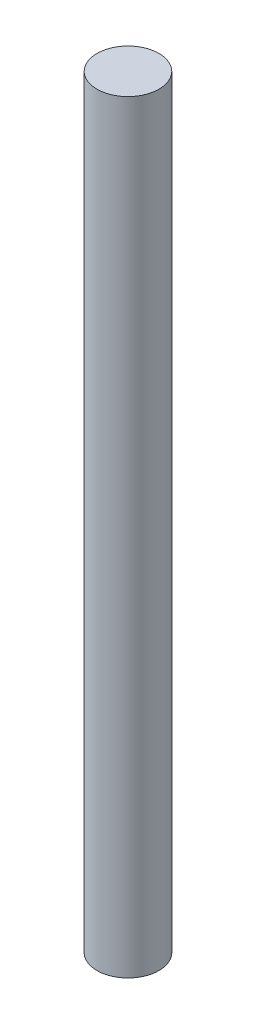
ISO-10303-21;
HEADER;
FILE_DESCRIPTION(('STEP AP214'),'2;1');
FILE_NAME('part.step','',(''),(''),'','','');
FILE_SCHEMA(('AUTOMOTIVE_DESIGN { 1 0 10303 214 1 1 1 1 }'));
ENDSEC;
DATA;
#1=APPLICATION_CONTEXT('core data for automotive mechanical design processes');
#2=APPLICATION_PROTOCOL_DEFINITION('international standard','automotive_design',2000,#1);
#3=PRODUCT_CONTEXT('',#1,'mechanical');
#4=PRODUCT('Part','Part','',(#3));
#5=PRODUCT_RELATED_PRODUCT_CATEGORY('part','',(#4));
#6=PRODUCT_DEFINITION_FORMATION('','',#4);
#7=PRODUCT_DEFINITION_CONTEXT('part definition',#1,'design');
#8=PRODUCT_DEFINITION('design','',#6,#7);
#9=PRODUCT_DEFINITION_SHAPE('','',#8);
#10=(LENGTH_UNIT() NAMED_UNIT(*) SI_UNIT(.MILLI.,.METRE.));
#11=(NAMED_UNIT(*) PLANE_ANGLE_UNIT() SI_UNIT($,.RADIAN.));
#12=(NAMED_UNIT(*) SI_UNIT($,.STERADIAN.) SOLID_ANGLE_UNIT());
#13=UNCERTAINTY_MEASURE_WITH_UNIT(LENGTH_MEASURE(1.E-05),#10,'distance_accuracy_value','');
#14=(GEOMETRIC_REPRESENTATION_CONTEXT(3) GLOBAL_UNCERTAINTY_ASSIGNED_CONTEXT((#13)) GLOBAL_UNIT_ASSIGNED_CONTEXT((#10,
#11,#12)) REPRESENTATION_CONTEXT('',''));
#15=CARTESIAN_POINT('',(0.,0.,0.));
#16=DIRECTION('',(0.,0.,1.));
#17=DIRECTION('',(1.,0.,0.));
#18=AXIS2_PLACEMENT_3D('',#15,#16,#17);
#19=CARTESIAN_POINT('',(0.,39.16,0.));
#20=DIRECTION('',(0.,-1.,0.));
#21=DIRECTION('',(0.,0.,-1.));
#22=AXIS2_PLACEMENT_3D('',#19,#20,#21);
#23=CYLINDRICAL_SURFACE('',#22,1.59);
#24=CARTESIAN_POINT('',(0.,39.16,0.));
#25=DIRECTION('',(0.,1.,0.));
#26=DIRECTION('',(0.,0.,1.));
#27=AXIS2_PLACEMENT_3D('',#24,#25,#26);
#28=CIRCLE('',#27,1.59);
#29=CARTESIAN_POINT('',(0.,39.16,1.59));
#30=VERTEX_POINT('',#29);
#31=EDGE_CURVE('E10',#30,#30,#28,.T.);
#32=ORIENTED_EDGE('',*,*,#31,.F.);
#33=EDGE_LOOP('',(#32));
#34=FACE_BOUND('',#33,.T.);
#35=CARTESIAN_POINT('',(0.,0.,0.));
#36=DIRECTION('',(0.,1.,0.));
#37=DIRECTION('',(0.,0.,1.));
#38=AXIS2_PLACEMENT_3D('',#35,#36,#37);
#39=CIRCLE('',#38,1.59);
#40=CARTESIAN_POINT('',(0.,0.,1.59));
#41=VERTEX_POINT('',#40);
#42=EDGE_CURVE('E44',#41,#41,#39,.T.);
#43=ORIENTED_EDGE('',*,*,#42,.T.);
#44=EDGE_LOOP('',(#43));
#45=FACE_BOUND('',#44,.T.);
#46=ADVANCED_FACE('F41',(#34,#45),#23,.T.);
#47=CARTESIAN_POINT('',(0.,39.16,0.));
#48=DIRECTION('',(0.,1.,0.));
#49=DIRECTION('',(0.,0.,1.));
#50=AXIS2_PLACEMENT_3D('',#47,#48,#49);
#51=PLANE('',#50);
#52=ORIENTED_EDGE('',*,*,#31,.T.);
#53=EDGE_LOOP('',(#52));
#54=FACE_BOUND('',#53,.T.);
#55=ADVANCED_FACE('F58',(#54),#51,.T.);
#56=CARTESIAN_POINT('',(0.,0.,0.));
#57=DIRECTION('',(0.,1.,0.));
#58=DIRECTION('',(0.,0.,1.));
#59=AXIS2_PLACEMENT_3D('',#56,#57,#58);
#60=PLANE('',#59);
#61=ORIENTED_EDGE('',*,*,#42,.F.);
#62=EDGE_LOOP('',(#61));
#63=FACE_BOUND('',#62,.T.);
#64=ADVANCED_FACE('F56',(#63),#60,.F.);
#65=CLOSED_SHELL('',(#46,#55,#64));
#66=MANIFOLD_SOLID_BREP('B2',#65);
#67=ADVANCED_BREP_SHAPE_REPRESENTATION('',(#18,#66),#14);
#68=SHAPE_DEFINITION_REPRESENTATION(#9,#67);
ENDSEC;
END-ISO-10303-21;
